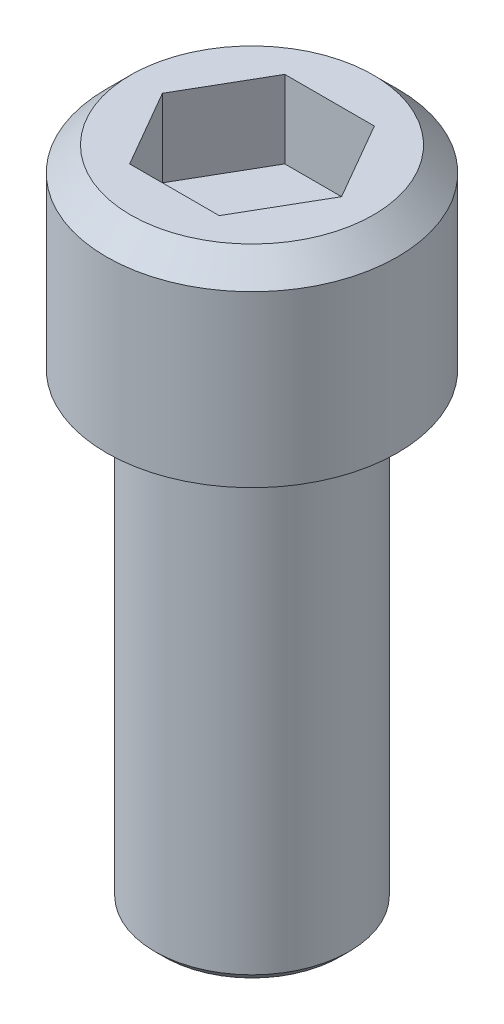
ISO-10303-21;
HEADER;
FILE_DESCRIPTION(('STEP AP214'),'2;1');
FILE_NAME('part.step','',(''),(''),'','','');
FILE_SCHEMA(('AUTOMOTIVE_DESIGN { 1 0 10303 214 1 1 1 1 }'));
ENDSEC;
DATA;
#1=APPLICATION_CONTEXT('core data for automotive mechanical design processes');
#2=APPLICATION_PROTOCOL_DEFINITION('international standard','automotive_design',2000,#1);
#3=PRODUCT_CONTEXT('',#1,'mechanical');
#4=PRODUCT('Part','Part','',(#3));
#5=PRODUCT_RELATED_PRODUCT_CATEGORY('part','',(#4));
#6=PRODUCT_DEFINITION_FORMATION('','',#4);
#7=PRODUCT_DEFINITION_CONTEXT('part definition',#1,'design');
#8=PRODUCT_DEFINITION('design','',#6,#7);
#9=PRODUCT_DEFINITION_SHAPE('','',#8);
#10=(LENGTH_UNIT() NAMED_UNIT(*) SI_UNIT(.MILLI.,.METRE.));
#11=(NAMED_UNIT(*) PLANE_ANGLE_UNIT() SI_UNIT($,.RADIAN.));
#12=(NAMED_UNIT(*) SI_UNIT($,.STERADIAN.) SOLID_ANGLE_UNIT());
#13=UNCERTAINTY_MEASURE_WITH_UNIT(LENGTH_MEASURE(1.E-05),#10,'distance_accuracy_value','');
#14=(GEOMETRIC_REPRESENTATION_CONTEXT(3) GLOBAL_UNCERTAINTY_ASSIGNED_CONTEXT((#13)) GLOBAL_UNIT_ASSIGNED_CONTEXT((#10,
#11,#12)) REPRESENTATION_CONTEXT('',''));
#15=CARTESIAN_POINT('',(0.,0.,0.));
#16=DIRECTION('',(0.,0.,1.));
#17=DIRECTION('',(1.,0.,0.));
#18=AXIS2_PLACEMENT_3D('',#15,#16,#17);
#19=CARTESIAN_POINT('',(0.,0.,0.));
#20=DIRECTION('',(0.,-1.,0.));
#21=DIRECTION('',(0.,0.,-1.));
#22=AXIS2_PLACEMENT_3D('',#19,#20,#21);
#23=CYLINDRICAL_SURFACE('',#22,11.9126);
#24=CARTESIAN_POINT('',(0.,13.8938,0.));
#25=DIRECTION('',(0.,1.,0.));
#26=DIRECTION('',(0.,0.,1.));
#27=AXIS2_PLACEMENT_3D('',#24,#25,#26);
#28=CIRCLE('',#27,11.9126);
#29=CARTESIAN_POINT('',(0.,13.8938,11.9126));
#30=VERTEX_POINT('',#29);
#31=EDGE_CURVE('E151',#30,#30,#28,.F.);
#32=ORIENTED_EDGE('',*,*,#31,.T.);
#33=EDGE_LOOP('',(#32));
#34=FACE_BOUND('',#33,.T.);
#35=CARTESIAN_POINT('',(0.,0.,0.));
#36=DIRECTION('',(0.,-1.,0.));
#37=DIRECTION('',(0.,0.,-1.));
#38=AXIS2_PLACEMENT_3D('',#35,#36,#37);
#39=CIRCLE('',#38,11.9126);
#40=CARTESIAN_POINT('',(0.,0.,-11.9126));
#41=VERTEX_POINT('',#40);
#42=EDGE_CURVE('E139',#41,#41,#39,.T.);
#43=ORIENTED_EDGE('',*,*,#42,.F.);
#44=EDGE_LOOP('',(#43));
#45=FACE_BOUND('',#44,.T.);
#46=ADVANCED_FACE('F40',(#34,#45),#23,.T.);
#47=CARTESIAN_POINT('',(11.9126,15.875,0.));
#48=DIRECTION('',(0.,1.,0.));
#49=DIRECTION('',(0.,0.,1.));
#50=AXIS2_PLACEMENT_3D('',#47,#48,#49);
#51=PLANE('',#50);
#52=CARTESIAN_POINT('',(0.,15.875,0.));
#53=DIRECTION('',(0.,1.,0.));
#54=DIRECTION('',(0.,0.,1.));
#55=AXIS2_PLACEMENT_3D('',#52,#53,#54);
#56=CIRCLE('',#55,9.93139999999999);
#57=CARTESIAN_POINT('',(0.,15.875,9.93139999999999));
#58=VERTEX_POINT('',#57);
#59=EDGE_CURVE('E154',#58,#58,#56,.T.);
#60=ORIENTED_EDGE('',*,*,#59,.T.);
#61=EDGE_LOOP('',(#60));
#62=FACE_BOUND('',#61,.T.);
#63=DIRECTION('',(1.,0.,0.));
#64=VECTOR('',#63,1.);
#65=CARTESIAN_POINT('',(-3.66617420935412,15.875,6.35));
#66=LINE('',#65,#64);
#67=CARTESIAN_POINT('',(-3.66617420935412,15.875,6.35));
#68=VERTEX_POINT('',#67);
#69=CARTESIAN_POINT('',(3.66617420935412,15.875,6.35));
#70=VERTEX_POINT('',#69);
#71=EDGE_CURVE('E54',#68,#70,#66,.T.);
#72=ORIENTED_EDGE('',*,*,#71,.F.);
#73=DIRECTION('',(0.5,0.,0.866025403784439));
#74=VECTOR('',#73,1.);
#75=CARTESIAN_POINT('',(-7.33234841870825,15.875,0.));
#76=LINE('',#75,#74);
#77=CARTESIAN_POINT('',(-7.33234841870825,15.875,0.));
#78=VERTEX_POINT('',#77);
#79=EDGE_CURVE('E123',#78,#68,#76,.T.);
#80=ORIENTED_EDGE('',*,*,#79,.F.);
#81=DIRECTION('',(0.5,0.,-0.866025403784438));
#82=VECTOR('',#81,1.);
#83=CARTESIAN_POINT('',(-7.33234841870825,15.875,0.));
#84=LINE('',#83,#82);
#85=CARTESIAN_POINT('',(-3.66617420935412,15.875,-6.35));
#86=VERTEX_POINT('',#85);
#87=EDGE_CURVE('E118',#78,#86,#84,.T.);
#88=ORIENTED_EDGE('',*,*,#87,.T.);
#89=DIRECTION('',(1.,0.,0.));
#90=VECTOR('',#89,1.);
#91=CARTESIAN_POINT('',(-3.66617420935412,15.875,-6.35));
#92=LINE('',#91,#90);
#93=CARTESIAN_POINT('',(3.66617420935412,15.875,-6.35));
#94=VERTEX_POINT('',#93);
#95=EDGE_CURVE('E116',#86,#94,#92,.T.);
#96=ORIENTED_EDGE('',*,*,#95,.T.);
#97=DIRECTION('',(-0.5,0.,-0.866025403784438));
#98=VECTOR('',#97,1.);
#99=CARTESIAN_POINT('',(7.33234841870825,15.875,0.));
#100=LINE('',#99,#98);
#101=CARTESIAN_POINT('',(7.33234841870825,15.875,0.));
#102=VERTEX_POINT('',#101);
#103=EDGE_CURVE('E99',#102,#94,#100,.T.);
#104=ORIENTED_EDGE('',*,*,#103,.F.);
#105=DIRECTION('',(-0.5,0.,0.866025403784438));
#106=VECTOR('',#105,1.);
#107=CARTESIAN_POINT('',(7.33234841870825,15.875,0.));
#108=LINE('',#107,#106);
#109=EDGE_CURVE('E109',#102,#70,#108,.T.);
#110=ORIENTED_EDGE('',*,*,#109,.T.);
#111=EDGE_LOOP('',(#72,#80,#88,#96,#104,#110));
#112=FACE_BOUND('',#111,.T.);
#113=ADVANCED_FACE('F113',(#62,#112),#51,.T.);
#114=CARTESIAN_POINT('',(0.,-38.1,0.));
#115=DIRECTION('',(0.,-1.,0.));
#116=DIRECTION('',(0.,0.,-1.));
#117=AXIS2_PLACEMENT_3D('',#114,#115,#116);
#118=PLANE('',#117);
#119=CARTESIAN_POINT('',(0.,-38.1,0.));
#120=DIRECTION('',(0.,-1.,0.));
#121=DIRECTION('',(0.,0.,-1.));
#122=AXIS2_PLACEMENT_3D('',#119,#120,#121);
#123=CIRCLE('',#122,7.18819999999999);
#124=CARTESIAN_POINT('',(0.,-38.1,-7.18819999999999));
#125=VERTEX_POINT('',#124);
#126=EDGE_CURVE('E47',#125,#125,#123,.T.);
#127=ORIENTED_EDGE('',*,*,#126,.T.);
#128=EDGE_LOOP('',(#127));
#129=FACE_BOUND('',#128,.T.);
#130=ADVANCED_FACE('F159',(#129),#118,.T.);
#131=CARTESIAN_POINT('',(0.,0.,0.));
#132=DIRECTION('',(0.,-1.,0.));
#133=DIRECTION('',(0.,0.,-1.));
#134=AXIS2_PLACEMENT_3D('',#131,#132,#133);
#135=CYLINDRICAL_SURFACE('',#134,7.9502);
#136=CARTESIAN_POINT('',(0.,-37.338,0.));
#137=DIRECTION('',(0.,-1.,0.));
#138=DIRECTION('',(0.,0.,-1.));
#139=AXIS2_PLACEMENT_3D('',#136,#137,#138);
#140=CIRCLE('',#139,7.9502);
#141=CARTESIAN_POINT('',(0.,-37.338,-7.9502));
#142=VERTEX_POINT('',#141);
#143=EDGE_CURVE('E11',#142,#142,#140,.F.);
#144=ORIENTED_EDGE('',*,*,#143,.T.);
#145=EDGE_LOOP('',(#144));
#146=FACE_BOUND('',#145,.T.);
#147=CARTESIAN_POINT('',(0.,0.,0.));
#148=DIRECTION('',(0.,-1.,0.));
#149=DIRECTION('',(0.,0.,-1.));
#150=AXIS2_PLACEMENT_3D('',#147,#148,#149);
#151=CIRCLE('',#150,7.9502);
#152=CARTESIAN_POINT('',(0.,0.,-7.9502));
#153=VERTEX_POINT('',#152);
#154=EDGE_CURVE('E148',#153,#153,#151,.T.);
#155=ORIENTED_EDGE('',*,*,#154,.T.);
#156=EDGE_LOOP('',(#155));
#157=FACE_BOUND('',#156,.T.);
#158=ADVANCED_FACE('F187',(#146,#157),#135,.T.);
#159=CARTESIAN_POINT('',(7.9502,0.,0.));
#160=DIRECTION('',(0.,-1.,0.));
#161=DIRECTION('',(0.,0.,-1.));
#162=AXIS2_PLACEMENT_3D('',#159,#160,#161);
#163=PLANE('',#162);
#164=ORIENTED_EDGE('',*,*,#42,.T.);
#165=EDGE_LOOP('',(#164));
#166=FACE_BOUND('',#165,.T.);
#167=ORIENTED_EDGE('',*,*,#154,.F.);
#168=EDGE_LOOP('',(#167));
#169=FACE_BOUND('',#168,.T.);
#170=ADVANCED_FACE('F183',(#166,#169),#163,.T.);
#171=CARTESIAN_POINT('',(-3.66617420935412,9.525,6.35));
#172=DIRECTION('',(0.,0.,1.));
#173=DIRECTION('',(1.,0.,0.));
#174=AXIS2_PLACEMENT_3D('',#171,#172,#173);
#175=PLANE('',#174);
#176=ORIENTED_EDGE('',*,*,#71,.T.);
#177=DIRECTION('',(0.,1.,0.));
#178=VECTOR('',#177,1.);
#179=CARTESIAN_POINT('',(3.66617420935412,9.525,6.35));
#180=LINE('',#179,#178);
#181=CARTESIAN_POINT('',(3.66617420935412,9.525,6.35));
#182=VERTEX_POINT('',#181);
#183=EDGE_CURVE('E106',#182,#70,#180,.T.);
#184=ORIENTED_EDGE('',*,*,#183,.F.);
#185=DIRECTION('',(1.,0.,0.));
#186=VECTOR('',#185,1.);
#187=CARTESIAN_POINT('',(-3.66617420935412,9.525,6.35));
#188=LINE('',#187,#186);
#189=CARTESIAN_POINT('',(-3.66617420935412,9.525,6.35));
#190=VERTEX_POINT('',#189);
#191=EDGE_CURVE('E125',#190,#182,#188,.T.);
#192=ORIENTED_EDGE('',*,*,#191,.F.);
#193=DIRECTION('',(0.,1.,0.));
#194=VECTOR('',#193,1.);
#195=CARTESIAN_POINT('',(-3.66617420935412,9.525,6.35));
#196=LINE('',#195,#194);
#197=EDGE_CURVE('E61',#190,#68,#196,.T.);
#198=ORIENTED_EDGE('',*,*,#197,.T.);
#199=EDGE_LOOP('',(#176,#184,#192,#198));
#200=FACE_BOUND('',#199,.T.);
#201=ADVANCED_FACE('F186',(#200),#175,.F.);
#202=CARTESIAN_POINT('',(-7.33234841870825,9.525,0.));
#203=DIRECTION('',(-0.866025403784438,0.,0.5));
#204=DIRECTION('',(0.5,0.,0.866025403784439));
#205=AXIS2_PLACEMENT_3D('',#202,#203,#204);
#206=PLANE('',#205);
#207=ORIENTED_EDGE('',*,*,#79,.T.);
#208=ORIENTED_EDGE('',*,*,#197,.F.);
#209=DIRECTION('',(0.5,0.,0.866025403784439));
#210=VECTOR('',#209,1.);
#211=CARTESIAN_POINT('',(-7.33234841870825,9.525,0.));
#212=LINE('',#211,#210);
#213=CARTESIAN_POINT('',(-7.33234841870825,9.525,0.));
#214=VERTEX_POINT('',#213);
#215=EDGE_CURVE('E135',#214,#190,#212,.T.);
#216=ORIENTED_EDGE('',*,*,#215,.F.);
#217=DIRECTION('',(0.,1.,0.));
#218=VECTOR('',#217,1.);
#219=CARTESIAN_POINT('',(-7.33234841870825,9.525,0.));
#220=LINE('',#219,#218);
#221=EDGE_CURVE('E140',#214,#78,#220,.T.);
#222=ORIENTED_EDGE('',*,*,#221,.T.);
#223=EDGE_LOOP('',(#207,#208,#216,#222));
#224=FACE_BOUND('',#223,.T.);
#225=ADVANCED_FACE('F201',(#224),#206,.F.);
#226=CARTESIAN_POINT('',(-7.33234841870825,9.525,0.));
#227=DIRECTION('',(0.866025403784439,0.,0.5));
#228=DIRECTION('',(0.5,0.,-0.866025403784439));
#229=AXIS2_PLACEMENT_3D('',#226,#227,#228);
#230=PLANE('',#229);
#231=ORIENTED_EDGE('',*,*,#87,.F.);
#232=ORIENTED_EDGE('',*,*,#221,.F.);
#233=DIRECTION('',(0.5,0.,-0.866025403784438));
#234=VECTOR('',#233,1.);
#235=CARTESIAN_POINT('',(-7.33234841870825,9.525,0.));
#236=LINE('',#235,#234);
#237=CARTESIAN_POINT('',(-3.66617420935412,9.525,-6.35));
#238=VERTEX_POINT('',#237);
#239=EDGE_CURVE('E133',#214,#238,#236,.T.);
#240=ORIENTED_EDGE('',*,*,#239,.T.);
#241=DIRECTION('',(0.,1.,0.));
#242=VECTOR('',#241,1.);
#243=CARTESIAN_POINT('',(-3.66617420935412,9.525,-6.35));
#244=LINE('',#243,#242);
#245=EDGE_CURVE('E142',#238,#86,#244,.T.);
#246=ORIENTED_EDGE('',*,*,#245,.T.);
#247=EDGE_LOOP('',(#231,#232,#240,#246));
#248=FACE_BOUND('',#247,.T.);
#249=ADVANCED_FACE('F209',(#248),#230,.T.);
#250=CARTESIAN_POINT('',(-3.66617420935412,9.525,-6.35));
#251=DIRECTION('',(0.,0.,1.));
#252=DIRECTION('',(1.,0.,0.));
#253=AXIS2_PLACEMENT_3D('',#250,#251,#252);
#254=PLANE('',#253);
#255=ORIENTED_EDGE('',*,*,#95,.F.);
#256=ORIENTED_EDGE('',*,*,#245,.F.);
#257=DIRECTION('',(1.,0.,0.));
#258=VECTOR('',#257,1.);
#259=CARTESIAN_POINT('',(-3.66617420935412,9.525,-6.35));
#260=LINE('',#259,#258);
#261=CARTESIAN_POINT('',(3.66617420935412,9.525,-6.35));
#262=VERTEX_POINT('',#261);
#263=EDGE_CURVE('E131',#238,#262,#260,.T.);
#264=ORIENTED_EDGE('',*,*,#263,.T.);
#265=DIRECTION('',(0.,1.,0.));
#266=VECTOR('',#265,1.);
#267=CARTESIAN_POINT('',(3.66617420935412,9.525,-6.35));
#268=LINE('',#267,#266);
#269=EDGE_CURVE('E105',#262,#94,#268,.T.);
#270=ORIENTED_EDGE('',*,*,#269,.T.);
#271=EDGE_LOOP('',(#255,#256,#264,#270));
#272=FACE_BOUND('',#271,.T.);
#273=ADVANCED_FACE('F206',(#272),#254,.T.);
#274=CARTESIAN_POINT('',(7.33234841870825,9.525,0.));
#275=DIRECTION('',(0.866025403784439,0.,-0.5));
#276=DIRECTION('',(-0.5,0.,-0.866025403784439));
#277=AXIS2_PLACEMENT_3D('',#274,#275,#276);
#278=PLANE('',#277);
#279=ORIENTED_EDGE('',*,*,#103,.T.);
#280=ORIENTED_EDGE('',*,*,#269,.F.);
#281=DIRECTION('',(-0.5,0.,-0.866025403784438));
#282=VECTOR('',#281,1.);
#283=CARTESIAN_POINT('',(7.33234841870825,9.525,0.));
#284=LINE('',#283,#282);
#285=CARTESIAN_POINT('',(7.33234841870825,9.525,0.));
#286=VERTEX_POINT('',#285);
#287=EDGE_CURVE('E102',#286,#262,#284,.T.);
#288=ORIENTED_EDGE('',*,*,#287,.F.);
#289=DIRECTION('',(0.,1.,0.));
#290=VECTOR('',#289,1.);
#291=CARTESIAN_POINT('',(7.33234841870825,9.525,0.));
#292=LINE('',#291,#290);
#293=EDGE_CURVE('E94',#286,#102,#292,.T.);
#294=ORIENTED_EDGE('',*,*,#293,.T.);
#295=EDGE_LOOP('',(#279,#280,#288,#294));
#296=FACE_BOUND('',#295,.T.);
#297=ADVANCED_FACE('F96',(#296),#278,.F.);
#298=CARTESIAN_POINT('',(7.33234841870825,9.525,0.));
#299=DIRECTION('',(-0.866025403784438,0.,-0.5));
#300=DIRECTION('',(-0.5,0.,0.866025403784438));
#301=AXIS2_PLACEMENT_3D('',#298,#299,#300);
#302=PLANE('',#301);
#303=ORIENTED_EDGE('',*,*,#109,.F.);
#304=ORIENTED_EDGE('',*,*,#293,.F.);
#305=DIRECTION('',(-0.5,0.,0.866025403784438));
#306=VECTOR('',#305,1.);
#307=CARTESIAN_POINT('',(7.33234841870825,9.525,0.));
#308=LINE('',#307,#306);
#309=EDGE_CURVE('E128',#286,#182,#308,.T.);
#310=ORIENTED_EDGE('',*,*,#309,.T.);
#311=ORIENTED_EDGE('',*,*,#183,.T.);
#312=EDGE_LOOP('',(#303,#304,#310,#311));
#313=FACE_BOUND('',#312,.T.);
#314=ADVANCED_FACE('F110',(#313),#302,.T.);
#315=CARTESIAN_POINT('',(10.9985226280624,9.525,6.35));
#316=DIRECTION('',(0.,1.,0.));
#317=DIRECTION('',(0.,0.,1.));
#318=AXIS2_PLACEMENT_3D('',#315,#316,#317);
#319=PLANE('',#318);
#320=ORIENTED_EDGE('',*,*,#191,.T.);
#321=ORIENTED_EDGE('',*,*,#309,.F.);
#322=ORIENTED_EDGE('',*,*,#287,.T.);
#323=ORIENTED_EDGE('',*,*,#263,.F.);
#324=ORIENTED_EDGE('',*,*,#239,.F.);
#325=ORIENTED_EDGE('',*,*,#215,.T.);
#326=EDGE_LOOP('',(#320,#321,#322,#323,#324,#325));
#327=FACE_BOUND('',#326,.T.);
#328=ADVANCED_FACE('F169',(#327),#319,.T.);
#329=CARTESIAN_POINT('',(0.,13.8938,0.));
#330=DIRECTION('',(0.,-1.,0.));
#331=DIRECTION('',(0.,0.,-1.));
#332=AXIS2_PLACEMENT_3D('',#329,#330,#331);
#333=CONICAL_SURFACE('',#332,11.9126,0.785398163397443);
#334=ORIENTED_EDGE('',*,*,#59,.F.);
#335=EDGE_LOOP('',(#334));
#336=FACE_BOUND('',#335,.T.);
#337=ORIENTED_EDGE('',*,*,#31,.F.);
#338=EDGE_LOOP('',(#337));
#339=FACE_BOUND('',#338,.T.);
#340=ADVANCED_FACE('F163',(#336,#339),#333,.T.);
#341=CARTESIAN_POINT('',(0.,-38.1,0.));
#342=DIRECTION('',(0.,1.,0.));
#343=DIRECTION('',(0.,0.,1.));
#344=AXIS2_PLACEMENT_3D('',#341,#342,#343);
#345=CONICAL_SURFACE('',#344,7.18819999999999,0.785398163397453);
#346=ORIENTED_EDGE('',*,*,#143,.F.);
#347=EDGE_LOOP('',(#346));
#348=FACE_BOUND('',#347,.T.);
#349=ORIENTED_EDGE('',*,*,#126,.F.);
#350=EDGE_LOOP('',(#349));
#351=FACE_BOUND('',#350,.T.);
#352=ADVANCED_FACE('F161',(#348,#351),#345,.T.);
#353=CLOSED_SHELL('',(#46,#113,#130,#158,#170,#201,#225,#249,#273,#297,#314,#328,#340,#352));
#354=MANIFOLD_SOLID_BREP('B2',#353);
#355=ADVANCED_BREP_SHAPE_REPRESENTATION('',(#18,#354),#14);
#356=SHAPE_DEFINITION_REPRESENTATION(#9,#355);
ENDSEC;
END-ISO-10303-21;
